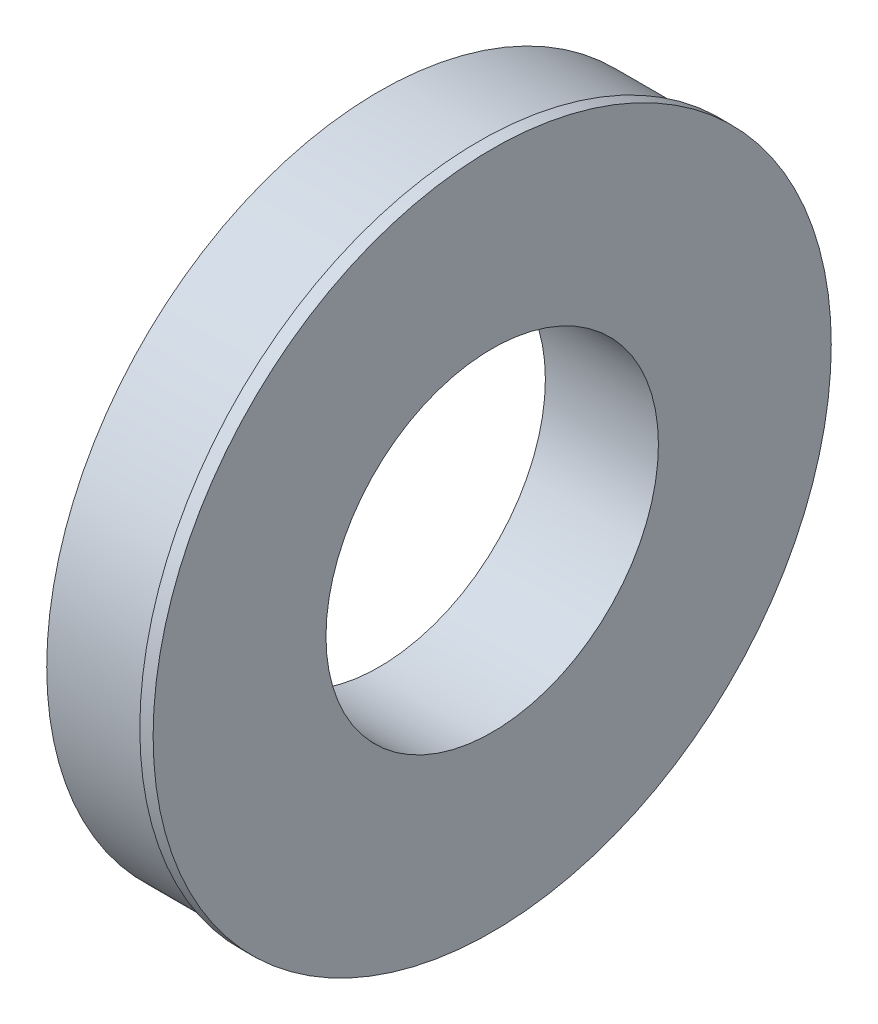
ISO-10303-21;
HEADER;
FILE_DESCRIPTION(('STEP AP214'),'2;1');
FILE_NAME('part.step','',(''),(''),'','','');
FILE_SCHEMA(('AUTOMOTIVE_DESIGN { 1 0 10303 214 1 1 1 1 }'));
ENDSEC;
DATA;
#1=APPLICATION_CONTEXT('core data for automotive mechanical design processes');
#2=APPLICATION_PROTOCOL_DEFINITION('international standard','automotive_design',2000,#1);
#3=PRODUCT_CONTEXT('',#1,'mechanical');
#4=PRODUCT('Part','Part','',(#3));
#5=PRODUCT_RELATED_PRODUCT_CATEGORY('part','',(#4));
#6=PRODUCT_DEFINITION_FORMATION('','',#4);
#7=PRODUCT_DEFINITION_CONTEXT('part definition',#1,'design');
#8=PRODUCT_DEFINITION('design','',#6,#7);
#9=PRODUCT_DEFINITION_SHAPE('','',#8);
#10=(LENGTH_UNIT() NAMED_UNIT(*) SI_UNIT(.MILLI.,.METRE.));
#11=(NAMED_UNIT(*) PLANE_ANGLE_UNIT() SI_UNIT($,.RADIAN.));
#12=(NAMED_UNIT(*) SI_UNIT($,.STERADIAN.) SOLID_ANGLE_UNIT());
#13=UNCERTAINTY_MEASURE_WITH_UNIT(LENGTH_MEASURE(1.E-05),#10,'distance_accuracy_value','');
#14=(GEOMETRIC_REPRESENTATION_CONTEXT(3) GLOBAL_UNCERTAINTY_ASSIGNED_CONTEXT((#13)) GLOBAL_UNIT_ASSIGNED_CONTEXT((#10,
#11,#12)) REPRESENTATION_CONTEXT('',''));
#15=CARTESIAN_POINT('',(0.,0.,0.));
#16=DIRECTION('',(0.,0.,1.));
#17=DIRECTION('',(1.,0.,0.));
#18=AXIS2_PLACEMENT_3D('',#15,#16,#17);
#19=CARTESIAN_POINT('',(0.,0.,0.));
#20=DIRECTION('',(1.,0.,0.));
#21=DIRECTION('',(0.,0.,-1.));
#22=AXIS2_PLACEMENT_3D('',#19,#20,#21);
#23=PLANE('',#22);
#24=CARTESIAN_POINT('',(0.,0.,0.));
#25=DIRECTION('',(1.,0.,0.));
#26=DIRECTION('',(0.,0.,-1.));
#27=AXIS2_PLACEMENT_3D('',#24,#25,#26);
#28=CIRCLE('',#27,63.5);
#29=CARTESIAN_POINT('',(0.,0.,63.5));
#30=VERTEX_POINT('',#29);
#31=EDGE_CURVE('E38',#30,#30,#28,.T.);
#32=ORIENTED_EDGE('',*,*,#31,.F.);
#33=EDGE_LOOP('',(#32));
#34=FACE_BOUND('',#33,.T.);
#35=CARTESIAN_POINT('',(0.,0.,0.));
#36=DIRECTION('',(1.,0.,0.));
#37=DIRECTION('',(0.,0.,-1.));
#38=AXIS2_PLACEMENT_3D('',#35,#36,#37);
#39=CIRCLE('',#38,31.75);
#40=CARTESIAN_POINT('',(0.,0.,31.75));
#41=VERTEX_POINT('',#40);
#42=EDGE_CURVE('E45',#41,#41,#39,.T.);
#43=ORIENTED_EDGE('',*,*,#42,.T.);
#44=EDGE_LOOP('',(#43));
#45=FACE_BOUND('',#44,.T.);
#46=ADVANCED_FACE('F34',(#34,#45),#23,.F.);
#47=CARTESIAN_POINT('',(19.05,0.,0.));
#48=DIRECTION('',(-1.,0.,0.));
#49=DIRECTION('',(0.,0.,1.));
#50=AXIS2_PLACEMENT_3D('',#47,#48,#49);
#51=CYLINDRICAL_SURFACE('',#50,63.5);
#52=CARTESIAN_POINT('',(19.05,0.,0.));
#53=DIRECTION('',(1.,0.,0.));
#54=DIRECTION('',(0.,0.,-1.));
#55=AXIS2_PLACEMENT_3D('',#52,#53,#54);
#56=CIRCLE('',#55,63.5);
#57=CARTESIAN_POINT('',(19.05,0.,63.5));
#58=VERTEX_POINT('',#57);
#59=EDGE_CURVE('E10',#58,#58,#56,.T.);
#60=CARTESIAN_POINT('',(19.05,0.,63.5));
#61=CARTESIAN_POINT('',(18.8515625,0.,63.5));
#62=CARTESIAN_POINT('',(18.653125,0.,63.5));
#63=CARTESIAN_POINT('',(18.25625,0.,63.5));
#64=CARTESIAN_POINT('',(18.0578125,0.,63.5));
#65=CARTESIAN_POINT('',(17.6609375,0.,63.5));
#66=CARTESIAN_POINT('',(17.4625,0.,63.5));
#67=CARTESIAN_POINT('',(17.065625,0.,63.5));
#68=CARTESIAN_POINT('',(16.8671875,0.,63.5));
#69=CARTESIAN_POINT('',(16.4703125,0.,63.5));
#70=CARTESIAN_POINT('',(16.271875,0.,63.5));
#71=CARTESIAN_POINT('',(15.875,0.,63.5));
#72=CARTESIAN_POINT('',(15.6765625,0.,63.5));
#73=CARTESIAN_POINT('',(15.2796875,0.,63.5));
#74=CARTESIAN_POINT('',(15.08125,0.,63.5));
#75=CARTESIAN_POINT('',(14.684375,0.,63.5));
#76=CARTESIAN_POINT('',(14.4859375,0.,63.5));
#77=CARTESIAN_POINT('',(14.0890625,0.,63.5));
#78=CARTESIAN_POINT('',(13.890625,0.,63.5));
#79=CARTESIAN_POINT('',(13.49375,0.,63.5));
#80=CARTESIAN_POINT('',(13.2953125,0.,63.5));
#81=CARTESIAN_POINT('',(12.8984375,0.,63.5));
#82=CARTESIAN_POINT('',(12.7,0.,63.5));
#83=CARTESIAN_POINT('',(12.303125,0.,63.5));
#84=CARTESIAN_POINT('',(12.1046875,0.,63.5));
#85=CARTESIAN_POINT('',(11.7078125,0.,63.5));
#86=CARTESIAN_POINT('',(11.509375,0.,63.5));
#87=CARTESIAN_POINT('',(11.1125,0.,63.5));
#88=CARTESIAN_POINT('',(10.9140625,0.,63.5));
#89=CARTESIAN_POINT('',(10.5171875,0.,63.5));
#90=CARTESIAN_POINT('',(10.31875,0.,63.5));
#91=CARTESIAN_POINT('',(9.921875,0.,63.5));
#92=CARTESIAN_POINT('',(9.7234375,0.,63.5));
#93=CARTESIAN_POINT('',(9.3265625,0.,63.5));
#94=CARTESIAN_POINT('',(9.128125,0.,63.5));
#95=CARTESIAN_POINT('',(8.73125,0.,63.5));
#96=CARTESIAN_POINT('',(8.5328125,0.,63.5));
#97=CARTESIAN_POINT('',(8.1359375,0.,63.5));
#98=CARTESIAN_POINT('',(7.9375,0.,63.5));
#99=CARTESIAN_POINT('',(7.540625,0.,63.5));
#100=CARTESIAN_POINT('',(7.3421875,0.,63.5));
#101=CARTESIAN_POINT('',(6.9453125,0.,63.5));
#102=CARTESIAN_POINT('',(6.746875,0.,63.5));
#103=CARTESIAN_POINT('',(6.35,0.,63.5));
#104=CARTESIAN_POINT('',(6.1515625,0.,63.5));
#105=CARTESIAN_POINT('',(5.7546875,0.,63.5));
#106=CARTESIAN_POINT('',(5.55625,0.,63.5));
#107=CARTESIAN_POINT('',(5.159375,0.,63.5));
#108=CARTESIAN_POINT('',(4.9609375,0.,63.5));
#109=CARTESIAN_POINT('',(4.5640625,0.,63.5));
#110=CARTESIAN_POINT('',(4.365625,0.,63.5));
#111=CARTESIAN_POINT('',(3.96875,0.,63.5));
#112=CARTESIAN_POINT('',(3.7703125,0.,63.5));
#113=CARTESIAN_POINT('',(3.3734375,0.,63.5));
#114=CARTESIAN_POINT('',(3.175,0.,63.5));
#115=CARTESIAN_POINT('',(2.778125,0.,63.5));
#116=CARTESIAN_POINT('',(2.5796875,0.,63.5));
#117=CARTESIAN_POINT('',(2.1828125,0.,63.5));
#118=CARTESIAN_POINT('',(1.984375,0.,63.5));
#119=CARTESIAN_POINT('',(1.5875,0.,63.5));
#120=CARTESIAN_POINT('',(1.3890625,0.,63.5));
#121=CARTESIAN_POINT('',(0.992187500000001,0.,63.5));
#122=CARTESIAN_POINT('',(0.793750000000001,0.,63.5));
#123=CARTESIAN_POINT('',(0.396875,0.,63.5));
#124=CARTESIAN_POINT('',(0.1984375,0.,63.5));
#125=CARTESIAN_POINT('',(0.,0.,63.5));
#126=B_SPLINE_CURVE_WITH_KNOTS('',3,(#60,#61,#62,#63,#64,#65,#66,#67,#68,#69,#70,#71,#72,#73,
#74,#75,#76,#77,#78,#79,#80,#81,#82,#83,#84,#85,#86,#87,#88,#89,#90,#91,#92,#93,#94,#95,#96,#97,
#98,#99,#100,#101,#102,#103,#104,#105,#106,#107,#108,#109,#110,#111,#112,#113,#114,#115,#116,
#117,#118,#119,#120,#121,#122,#123,#124,#125),.UNSPECIFIED.,.F.,.F.,(4,2,2,2,2,2,2,2,2,2,2,2,2,
2,2,2,2,2,2,2,2,2,2,2,2,2,2,2,2,2,2,2,4),(0.,0.5953125,1.190625,1.7859375,2.38125,2.9765625,
3.571875,4.1671875,4.7625,5.3578125,5.953125,6.5484375,7.14375,7.7390625,8.334375,8.9296875,
9.525,10.1203125,10.715625,11.3109375,11.90625,12.5015625,13.096875,13.6921875,14.2875,
14.8828125,15.478125,16.0734375,16.66875,17.2640625,17.859375,18.4546875,19.05),.UNSPECIFIED.);
#127=EDGE_CURVE('BSEAM36',#58,#30,#126,.T.);
#128=ORIENTED_EDGE('',*,*,#59,.F.);
#129=ORIENTED_EDGE('',*,*,#31,.T.);
#130=ORIENTED_EDGE('',*,*,#127,.T.);
#131=ORIENTED_EDGE('',*,*,#127,.F.);
#132=EDGE_LOOP('',(#128,#130,#129,#131));
#133=FACE_BOUND('',#132,.T.);
#134=ADVANCED_FACE('F36',(#133),#51,.T.);
#135=CARTESIAN_POINT('',(19.05,0.,0.));
#136=DIRECTION('',(-1.,0.,0.));
#137=DIRECTION('',(0.,0.,1.));
#138=AXIS2_PLACEMENT_3D('',#135,#136,#137);
#139=CYLINDRICAL_SURFACE('',#138,31.75);
#140=CARTESIAN_POINT('',(21.59,0.,0.));
#141=DIRECTION('',(1.,0.,0.));
#142=DIRECTION('',(0.,0.,-1.));
#143=AXIS2_PLACEMENT_3D('',#140,#141,#142);
#144=CIRCLE('',#143,31.75);
#145=CARTESIAN_POINT('',(21.59,0.,31.75));
#146=VERTEX_POINT('',#145);
#147=EDGE_CURVE('E53',#146,#146,#144,.T.);
#148=CARTESIAN_POINT('',(0.,0.,31.75));
#149=CARTESIAN_POINT('',(0.224895833333333,0.,31.75));
#150=CARTESIAN_POINT('',(0.449791666666667,0.,31.75));
#151=CARTESIAN_POINT('',(0.899583333333333,0.,31.75));
#152=CARTESIAN_POINT('',(1.12447916666667,0.,31.75));
#153=CARTESIAN_POINT('',(1.57427083333333,0.,31.75));
#154=CARTESIAN_POINT('',(1.79916666666667,0.,31.75));
#155=CARTESIAN_POINT('',(2.24895833333333,0.,31.75));
#156=CARTESIAN_POINT('',(2.47385416666667,0.,31.75));
#157=CARTESIAN_POINT('',(2.92364583333333,0.,31.75));
#158=CARTESIAN_POINT('',(3.14854166666667,0.,31.75));
#159=CARTESIAN_POINT('',(3.59833333333333,0.,31.75));
#160=CARTESIAN_POINT('',(3.82322916666667,0.,31.75));
#161=CARTESIAN_POINT('',(4.27302083333333,0.,31.75));
#162=CARTESIAN_POINT('',(4.49791666666667,0.,31.75));
#163=CARTESIAN_POINT('',(4.94770833333333,0.,31.75));
#164=CARTESIAN_POINT('',(5.17260416666667,0.,31.75));
#165=CARTESIAN_POINT('',(5.62239583333333,0.,31.75));
#166=CARTESIAN_POINT('',(5.84729166666667,0.,31.75));
#167=CARTESIAN_POINT('',(6.29708333333333,0.,31.75));
#168=CARTESIAN_POINT('',(6.52197916666667,0.,31.75));
#169=CARTESIAN_POINT('',(6.97177083333333,0.,31.75));
#170=CARTESIAN_POINT('',(7.19666666666667,0.,31.75));
#171=CARTESIAN_POINT('',(7.64645833333333,0.,31.75));
#172=CARTESIAN_POINT('',(7.87135416666667,0.,31.75));
#173=CARTESIAN_POINT('',(8.32114583333333,0.,31.75));
#174=CARTESIAN_POINT('',(8.54604166666667,0.,31.75));
#175=CARTESIAN_POINT('',(8.99583333333334,0.,31.75));
#176=CARTESIAN_POINT('',(9.22072916666667,0.,31.75));
#177=CARTESIAN_POINT('',(9.67052083333333,0.,31.75));
#178=CARTESIAN_POINT('',(9.89541666666667,0.,31.75));
#179=CARTESIAN_POINT('',(10.3452083333333,0.,31.75));
#180=CARTESIAN_POINT('',(10.5701041666667,0.,31.75));
#181=CARTESIAN_POINT('',(11.0198958333333,0.,31.75));
#182=CARTESIAN_POINT('',(11.2447916666667,0.,31.75));
#183=CARTESIAN_POINT('',(11.6945833333333,0.,31.75));
#184=CARTESIAN_POINT('',(11.9194791666667,0.,31.75));
#185=CARTESIAN_POINT('',(12.3692708333333,0.,31.75));
#186=CARTESIAN_POINT('',(12.5941666666667,0.,31.75));
#187=CARTESIAN_POINT('',(13.0439583333333,0.,31.75));
#188=CARTESIAN_POINT('',(13.2688541666667,0.,31.75));
#189=CARTESIAN_POINT('',(13.7186458333333,0.,31.75));
#190=CARTESIAN_POINT('',(13.9435416666667,0.,31.75));
#191=CARTESIAN_POINT('',(14.3933333333333,0.,31.75));
#192=CARTESIAN_POINT('',(14.6182291666667,0.,31.75));
#193=CARTESIAN_POINT('',(15.0680208333333,0.,31.75));
#194=CARTESIAN_POINT('',(15.2929166666667,0.,31.75));
#195=CARTESIAN_POINT('',(15.7427083333333,0.,31.75));
#196=CARTESIAN_POINT('',(15.9676041666667,0.,31.75));
#197=CARTESIAN_POINT('',(16.4173958333333,0.,31.75));
#198=CARTESIAN_POINT('',(16.6422916666667,0.,31.75));
#199=CARTESIAN_POINT('',(17.0920833333333,0.,31.75));
#200=CARTESIAN_POINT('',(17.3169791666667,0.,31.75));
#201=CARTESIAN_POINT('',(17.7667708333333,0.,31.75));
#202=CARTESIAN_POINT('',(17.9916666666667,0.,31.75));
#203=CARTESIAN_POINT('',(18.4414583333333,0.,31.75));
#204=CARTESIAN_POINT('',(18.6663541666667,0.,31.75));
#205=CARTESIAN_POINT('',(19.1161458333333,0.,31.75));
#206=CARTESIAN_POINT('',(19.3410416666667,0.,31.75));
#207=CARTESIAN_POINT('',(19.7908333333333,0.,31.75));
#208=CARTESIAN_POINT('',(20.0157291666667,0.,31.75));
#209=CARTESIAN_POINT('',(20.4655208333333,0.,31.75));
#210=CARTESIAN_POINT('',(20.6904166666667,0.,31.75));
#211=CARTESIAN_POINT('',(21.1402083333333,0.,31.75));
#212=CARTESIAN_POINT('',(21.3651041666667,0.,31.75));
#213=CARTESIAN_POINT('',(21.59,0.,31.75));
#214=B_SPLINE_CURVE_WITH_KNOTS('',3,(#148,#149,#150,#151,#152,#153,#154,#155,#156,#157,#158,
#159,#160,#161,#162,#163,#164,#165,#166,#167,#168,#169,#170,#171,#172,#173,#174,#175,#176,#177,
#178,#179,#180,#181,#182,#183,#184,#185,#186,#187,#188,#189,#190,#191,#192,#193,#194,#195,#196,
#197,#198,#199,#200,#201,#202,#203,#204,#205,#206,#207,#208,#209,#210,#211,#212,#213),
.UNSPECIFIED.,.F.,.F.,(4,2,2,2,2,2,2,2,2,2,2,2,2,2,2,2,2,2,2,2,2,2,2,2,2,2,2,2,2,2,2,2,4),(0.,
0.6746875,1.349375,2.0240625,2.69875,3.3734375,4.048125,4.7228125,5.3975,6.0721875,6.746875,
7.4215625,8.09625,8.7709375,9.445625,10.1203125,10.795,11.4696875,12.144375,12.8190625,13.49375,
14.1684375,14.843125,15.5178125,16.1925,16.8671875,17.541875,18.2165625,18.89125,19.5659375,
20.240625,20.9153125,21.59),.UNSPECIFIED.);
#215=EDGE_CURVE('BSEAM59',#41,#146,#214,.T.);
#216=ORIENTED_EDGE('',*,*,#42,.F.);
#217=ORIENTED_EDGE('',*,*,#147,.T.);
#218=ORIENTED_EDGE('',*,*,#215,.T.);
#219=ORIENTED_EDGE('',*,*,#215,.F.);
#220=EDGE_LOOP('',(#216,#218,#217,#219));
#221=FACE_BOUND('',#220,.T.);
#222=ADVANCED_FACE('F59',(#221),#139,.F.);
#223=CARTESIAN_POINT('',(21.59,0.,0.));
#224=DIRECTION('',(1.,0.,0.));
#225=DIRECTION('',(0.,0.,-1.));
#226=AXIS2_PLACEMENT_3D('',#223,#224,#225);
#227=PLANE('',#226);
#228=CARTESIAN_POINT('',(21.59,0.,0.));
#229=DIRECTION('',(1.,0.,0.));
#230=DIRECTION('',(0.,0.,-1.));
#231=AXIS2_PLACEMENT_3D('',#228,#229,#230);
#232=CIRCLE('',#231,64.77);
#233=CARTESIAN_POINT('',(21.59,0.,-64.77));
#234=VERTEX_POINT('',#233);
#235=EDGE_CURVE('E49',#234,#234,#232,.T.);
#236=ORIENTED_EDGE('',*,*,#235,.T.);
#237=EDGE_LOOP('',(#236));
#238=FACE_BOUND('',#237,.T.);
#239=ORIENTED_EDGE('',*,*,#147,.F.);
#240=EDGE_LOOP('',(#239));
#241=FACE_BOUND('',#240,.T.);
#242=ADVANCED_FACE('F61',(#238,#241),#227,.T.);
#243=CARTESIAN_POINT('',(19.05,0.,0.));
#244=DIRECTION('',(1.,0.,0.));
#245=DIRECTION('',(0.,0.,-1.));
#246=AXIS2_PLACEMENT_3D('',#243,#244,#245);
#247=PLANE('',#246);
#248=ORIENTED_EDGE('',*,*,#59,.T.);
#249=EDGE_LOOP('',(#248));
#250=FACE_BOUND('',#249,.T.);
#251=CARTESIAN_POINT('',(19.05,0.,0.));
#252=DIRECTION('',(1.,0.,0.));
#253=DIRECTION('',(0.,0.,-1.));
#254=AXIS2_PLACEMENT_3D('',#251,#252,#253);
#255=CIRCLE('',#254,64.77);
#256=CARTESIAN_POINT('',(19.05,0.,-64.77));
#257=VERTEX_POINT('',#256);
#258=EDGE_CURVE('E50',#257,#257,#255,.T.);
#259=ORIENTED_EDGE('',*,*,#258,.F.);
#260=EDGE_LOOP('',(#259));
#261=FACE_BOUND('',#260,.T.);
#262=ADVANCED_FACE('F63',(#250,#261),#247,.F.);
#263=CARTESIAN_POINT('',(21.59,0.,0.));
#264=DIRECTION('',(-1.,0.,0.));
#265=DIRECTION('',(0.,0.,1.));
#266=AXIS2_PLACEMENT_3D('',#263,#264,#265);
#267=CYLINDRICAL_SURFACE('',#266,64.77);
#268=ORIENTED_EDGE('',*,*,#235,.F.);
#269=EDGE_LOOP('',(#268));
#270=FACE_BOUND('',#269,.T.);
#271=ORIENTED_EDGE('',*,*,#258,.T.);
#272=EDGE_LOOP('',(#271));
#273=FACE_BOUND('',#272,.T.);
#274=ADVANCED_FACE('F70',(#270,#273),#267,.T.);
#275=CLOSED_SHELL('',(#46,#134,#222,#242,#262,#274));
#276=MANIFOLD_SOLID_BREP('B2',#275);
#277=ADVANCED_BREP_SHAPE_REPRESENTATION('',(#18,#276),#14);
#278=SHAPE_DEFINITION_REPRESENTATION(#9,#277);
ENDSEC;
END-ISO-10303-21;
